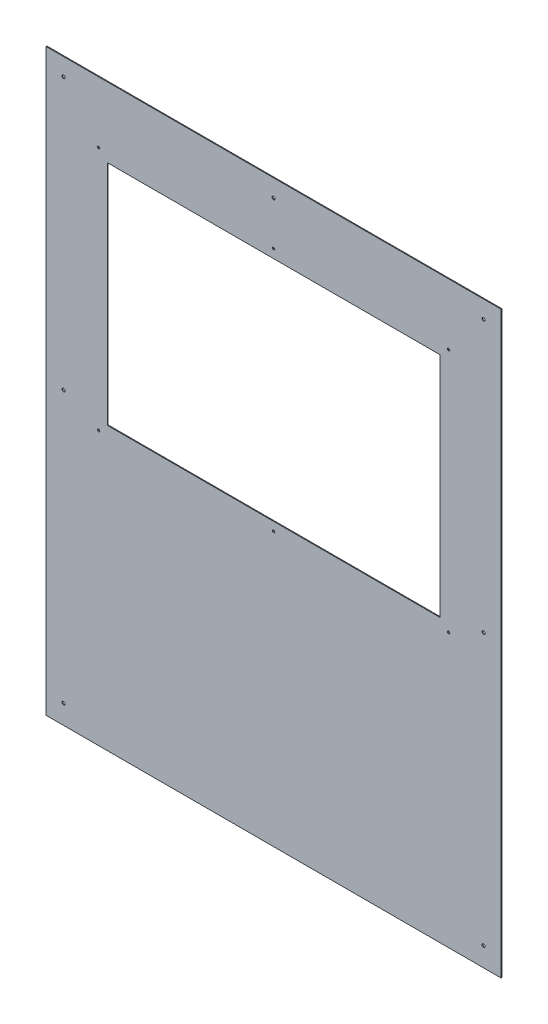
ISO-10303-21;
HEADER;
FILE_DESCRIPTION(('STEP AP214'),'2;1');
FILE_NAME('part.step','',(''),(''),'','','');
FILE_SCHEMA(('AUTOMOTIVE_DESIGN { 1 0 10303 214 1 1 1 1 }'));
ENDSEC;
DATA;
#1=APPLICATION_CONTEXT('core data for automotive mechanical design processes');
#2=APPLICATION_PROTOCOL_DEFINITION('international standard','automotive_design',2000,#1);
#3=PRODUCT_CONTEXT('',#1,'mechanical');
#4=PRODUCT('Part','Part','',(#3));
#5=PRODUCT_RELATED_PRODUCT_CATEGORY('part','',(#4));
#6=PRODUCT_DEFINITION_FORMATION('','',#4);
#7=PRODUCT_DEFINITION_CONTEXT('part definition',#1,'design');
#8=PRODUCT_DEFINITION('design','',#6,#7);
#9=PRODUCT_DEFINITION_SHAPE('','',#8);
#10=(LENGTH_UNIT() NAMED_UNIT(*) SI_UNIT(.MILLI.,.METRE.));
#11=(NAMED_UNIT(*) PLANE_ANGLE_UNIT() SI_UNIT($,.RADIAN.));
#12=(NAMED_UNIT(*) SI_UNIT($,.STERADIAN.) SOLID_ANGLE_UNIT());
#13=UNCERTAINTY_MEASURE_WITH_UNIT(LENGTH_MEASURE(1.E-05),#10,'distance_accuracy_value','');
#14=(GEOMETRIC_REPRESENTATION_CONTEXT(3) GLOBAL_UNCERTAINTY_ASSIGNED_CONTEXT((#13)) GLOBAL_UNIT_ASSIGNED_CONTEXT((#10,
#11,#12)) REPRESENTATION_CONTEXT('',''));
#15=CARTESIAN_POINT('',(0.,0.,0.));
#16=DIRECTION('',(0.,0.,1.));
#17=DIRECTION('',(1.,0.,0.));
#18=AXIS2_PLACEMENT_3D('',#15,#16,#17);
#19=CARTESIAN_POINT('',(0.,0.,1.2192));
#20=DIRECTION('',(1.,0.,0.));
#21=DIRECTION('',(0.,0.,-1.));
#22=AXIS2_PLACEMENT_3D('',#19,#20,#21);
#23=PLANE('',#22);
#24=DIRECTION('',(0.,-1.,0.));
#25=VECTOR('',#24,1.);
#26=CARTESIAN_POINT('',(0.,0.,0.));
#27=LINE('',#26,#25);
#28=CARTESIAN_POINT('',(0.,840.74,0.));
#29=VERTEX_POINT('',#28);
#30=CARTESIAN_POINT('',(0.,0.,0.));
#31=VERTEX_POINT('',#30);
#32=EDGE_CURVE('E170',#29,#31,#27,.T.);
#33=ORIENTED_EDGE('',*,*,#32,.T.);
#34=DIRECTION('',(0.,0.,-1.));
#35=VECTOR('',#34,1.);
#36=CARTESIAN_POINT('',(0.,0.,1.2192));
#37=LINE('',#36,#35);
#38=CARTESIAN_POINT('',(0.,0.,1.2192));
#39=VERTEX_POINT('',#38);
#40=EDGE_CURVE('E197',#39,#31,#37,.T.);
#41=ORIENTED_EDGE('',*,*,#40,.F.);
#42=DIRECTION('',(0.,-1.,0.));
#43=VECTOR('',#42,1.);
#44=CARTESIAN_POINT('',(0.,0.,1.2192));
#45=LINE('',#44,#43);
#46=CARTESIAN_POINT('',(0.,840.74,1.2192));
#47=VERTEX_POINT('',#46);
#48=EDGE_CURVE('E171',#47,#39,#45,.T.);
#49=ORIENTED_EDGE('',*,*,#48,.F.);
#50=DIRECTION('',(0.,0.,-1.));
#51=VECTOR('',#50,1.);
#52=CARTESIAN_POINT('',(0.,840.74,1.2192));
#53=LINE('',#52,#51);
#54=EDGE_CURVE('E181',#47,#29,#53,.T.);
#55=ORIENTED_EDGE('',*,*,#54,.T.);
#56=EDGE_LOOP('',(#33,#41,#49,#55));
#57=FACE_BOUND('',#56,.T.);
#58=ADVANCED_FACE('F35',(#57),#23,.F.);
#59=CARTESIAN_POINT('',(0.,0.,1.2192));
#60=DIRECTION('',(0.,1.,0.));
#61=DIRECTION('',(0.,0.,1.));
#62=AXIS2_PLACEMENT_3D('',#59,#60,#61);
#63=PLANE('',#62);
#64=DIRECTION('',(1.,0.,0.));
#65=VECTOR('',#64,1.);
#66=CARTESIAN_POINT('',(0.,0.,0.));
#67=LINE('',#66,#65);
#68=CARTESIAN_POINT('',(660.4,0.,0.));
#69=VERTEX_POINT('',#68);
#70=EDGE_CURVE('E184',#31,#69,#67,.T.);
#71=ORIENTED_EDGE('',*,*,#70,.T.);
#72=DIRECTION('',(0.,0.,-1.));
#73=VECTOR('',#72,1.);
#74=CARTESIAN_POINT('',(660.4,0.,1.2192));
#75=LINE('',#74,#73);
#76=CARTESIAN_POINT('',(660.4,0.,1.2192));
#77=VERTEX_POINT('',#76);
#78=EDGE_CURVE('E194',#77,#69,#75,.T.);
#79=ORIENTED_EDGE('',*,*,#78,.F.);
#80=DIRECTION('',(1.,0.,0.));
#81=VECTOR('',#80,1.);
#82=CARTESIAN_POINT('',(0.,0.,1.2192));
#83=LINE('',#82,#81);
#84=EDGE_CURVE('E174',#39,#77,#83,.T.);
#85=ORIENTED_EDGE('',*,*,#84,.F.);
#86=ORIENTED_EDGE('',*,*,#40,.T.);
#87=EDGE_LOOP('',(#71,#79,#85,#86));
#88=FACE_BOUND('',#87,.T.);
#89=ADVANCED_FACE('F262',(#88),#63,.F.);
#90=CARTESIAN_POINT('',(660.4,0.,1.2192));
#91=DIRECTION('',(-1.,0.,0.));
#92=DIRECTION('',(0.,0.,1.));
#93=AXIS2_PLACEMENT_3D('',#90,#91,#92);
#94=PLANE('',#93);
#95=DIRECTION('',(0.,1.,0.));
#96=VECTOR('',#95,1.);
#97=CARTESIAN_POINT('',(660.4,0.,0.));
#98=LINE('',#97,#96);
#99=CARTESIAN_POINT('',(660.4,840.74,0.));
#100=VERTEX_POINT('',#99);
#101=EDGE_CURVE('E186',#69,#100,#98,.T.);
#102=ORIENTED_EDGE('',*,*,#101,.T.);
#103=DIRECTION('',(0.,0.,-1.));
#104=VECTOR('',#103,1.);
#105=CARTESIAN_POINT('',(660.4,840.74,1.2192));
#106=LINE('',#105,#104);
#107=CARTESIAN_POINT('',(660.4,840.74,1.2192));
#108=VERTEX_POINT('',#107);
#109=EDGE_CURVE('E191',#108,#100,#106,.T.);
#110=ORIENTED_EDGE('',*,*,#109,.F.);
#111=DIRECTION('',(0.,1.,0.));
#112=VECTOR('',#111,1.);
#113=CARTESIAN_POINT('',(660.4,0.,1.2192));
#114=LINE('',#113,#112);
#115=EDGE_CURVE('E177',#77,#108,#114,.T.);
#116=ORIENTED_EDGE('',*,*,#115,.F.);
#117=ORIENTED_EDGE('',*,*,#78,.T.);
#118=EDGE_LOOP('',(#102,#110,#116,#117));
#119=FACE_BOUND('',#118,.T.);
#120=ADVANCED_FACE('F255',(#119),#94,.F.);
#121=CARTESIAN_POINT('',(0.,840.74,1.2192));
#122=DIRECTION('',(0.,-1.,0.));
#123=DIRECTION('',(0.,0.,-1.));
#124=AXIS2_PLACEMENT_3D('',#121,#122,#123);
#125=PLANE('',#124);
#126=DIRECTION('',(-1.,0.,0.));
#127=VECTOR('',#126,1.);
#128=CARTESIAN_POINT('',(0.,840.74,0.));
#129=LINE('',#128,#127);
#130=EDGE_CURVE('E175',#100,#29,#129,.T.);
#131=ORIENTED_EDGE('',*,*,#130,.T.);
#132=ORIENTED_EDGE('',*,*,#54,.F.);
#133=DIRECTION('',(-1.,0.,0.));
#134=VECTOR('',#133,1.);
#135=CARTESIAN_POINT('',(0.,840.74,1.2192));
#136=LINE('',#135,#134);
#137=EDGE_CURVE('E179',#108,#47,#136,.T.);
#138=ORIENTED_EDGE('',*,*,#137,.F.);
#139=ORIENTED_EDGE('',*,*,#109,.T.);
#140=EDGE_LOOP('',(#131,#132,#138,#139));
#141=FACE_BOUND('',#140,.T.);
#142=ADVANCED_FACE('F245',(#141),#125,.F.);
#143=CARTESIAN_POINT('',(0.,0.,1.2192));
#144=DIRECTION('',(0.,0.,-1.));
#145=DIRECTION('',(-1.,0.,0.));
#146=AXIS2_PLACEMENT_3D('',#143,#144,#145);
#147=PLANE('',#146);
#148=CARTESIAN_POINT('',(76.2,751.84,1.2192));
#149=DIRECTION('',(0.,0.,1.));
#150=DIRECTION('',(1.,0.,0.));
#151=AXIS2_PLACEMENT_3D('',#148,#149,#150);
#152=CIRCLE('',#151,1.72719999999998);
#153=CARTESIAN_POINT('',(77.9272,751.84,1.2192));
#154=VERTEX_POINT('',#153);
#155=EDGE_CURVE('E228',#154,#154,#152,.T.);
#156=ORIENTED_EDGE('',*,*,#155,.F.);
#157=EDGE_LOOP('',(#156));
#158=FACE_BOUND('',#157,.T.);
#159=CARTESIAN_POINT('',(330.2,751.84,1.2192));
#160=DIRECTION('',(0.,0.,1.));
#161=DIRECTION('',(1.,0.,0.));
#162=AXIS2_PLACEMENT_3D('',#159,#160,#161);
#163=CIRCLE('',#162,1.72719999999998);
#164=CARTESIAN_POINT('',(331.9272,751.84,1.2192));
#165=VERTEX_POINT('',#164);
#166=EDGE_CURVE('E218',#165,#165,#163,.T.);
#167=ORIENTED_EDGE('',*,*,#166,.F.);
#168=EDGE_LOOP('',(#167));
#169=FACE_BOUND('',#168,.T.);
#170=CARTESIAN_POINT('',(584.2,751.84,1.2192));
#171=DIRECTION('',(0.,0.,1.));
#172=DIRECTION('',(1.,0.,0.));
#173=AXIS2_PLACEMENT_3D('',#170,#171,#172);
#174=CIRCLE('',#173,1.72720000000004);
#175=CARTESIAN_POINT('',(585.9272,751.84,1.2192));
#176=VERTEX_POINT('',#175);
#177=EDGE_CURVE('E215',#176,#176,#174,.T.);
#178=ORIENTED_EDGE('',*,*,#177,.F.);
#179=EDGE_LOOP('',(#178));
#180=FACE_BOUND('',#179,.T.);
#181=CARTESIAN_POINT('',(584.2,396.24,1.2192));
#182=DIRECTION('',(0.,0.,1.));
#183=DIRECTION('',(1.,0.,0.));
#184=AXIS2_PLACEMENT_3D('',#181,#182,#183);
#185=CIRCLE('',#184,1.72720000000004);
#186=CARTESIAN_POINT('',(585.9272,396.24,1.2192));
#187=VERTEX_POINT('',#186);
#188=EDGE_CURVE('E214',#187,#187,#185,.T.);
#189=ORIENTED_EDGE('',*,*,#188,.F.);
#190=EDGE_LOOP('',(#189));
#191=FACE_BOUND('',#190,.T.);
#192=CARTESIAN_POINT('',(330.2,396.24,1.2192));
#193=DIRECTION('',(0.,0.,1.));
#194=DIRECTION('',(1.,0.,0.));
#195=AXIS2_PLACEMENT_3D('',#192,#193,#194);
#196=CIRCLE('',#195,1.72719999999998);
#197=CARTESIAN_POINT('',(331.9272,396.24,1.2192));
#198=VERTEX_POINT('',#197);
#199=EDGE_CURVE('E211',#198,#198,#196,.T.);
#200=ORIENTED_EDGE('',*,*,#199,.F.);
#201=EDGE_LOOP('',(#200));
#202=FACE_BOUND('',#201,.T.);
#203=CARTESIAN_POINT('',(76.2,396.24,1.2192));
#204=DIRECTION('',(0.,0.,1.));
#205=DIRECTION('',(1.,0.,0.));
#206=AXIS2_PLACEMENT_3D('',#203,#204,#205);
#207=CIRCLE('',#206,1.72719999999998);
#208=CARTESIAN_POINT('',(77.9272,396.24,1.2192));
#209=VERTEX_POINT('',#208);
#210=EDGE_CURVE('E207',#209,#209,#207,.T.);
#211=ORIENTED_EDGE('',*,*,#210,.F.);
#212=EDGE_LOOP('',(#211));
#213=FACE_BOUND('',#212,.T.);
#214=DIRECTION('',(1.,0.,0.));
#215=VECTOR('',#214,1.);
#216=CARTESIAN_POINT('',(88.9,408.94,1.2192));
#217=LINE('',#216,#215);
#218=CARTESIAN_POINT('',(88.9,408.94,1.2192));
#219=VERTEX_POINT('',#218);
#220=CARTESIAN_POINT('',(571.5,408.94,1.2192));
#221=VERTEX_POINT('',#220);
#222=EDGE_CURVE('E112',#219,#221,#217,.T.);
#223=ORIENTED_EDGE('',*,*,#222,.F.);
#224=DIRECTION('',(0.,-1.,0.));
#225=VECTOR('',#224,1.);
#226=CARTESIAN_POINT('',(88.9,739.14,1.2192));
#227=LINE('',#226,#225);
#228=CARTESIAN_POINT('',(88.9,739.14,1.2192));
#229=VERTEX_POINT('',#228);
#230=EDGE_CURVE('E51',#229,#219,#227,.T.);
#231=ORIENTED_EDGE('',*,*,#230,.F.);
#232=DIRECTION('',(-1.,0.,0.));
#233=VECTOR('',#232,1.);
#234=CARTESIAN_POINT('',(88.9,739.14,1.2192));
#235=LINE('',#234,#233);
#236=CARTESIAN_POINT('',(571.5,739.14,1.2192));
#237=VERTEX_POINT('',#236);
#238=EDGE_CURVE('E119',#237,#229,#235,.T.);
#239=ORIENTED_EDGE('',*,*,#238,.F.);
#240=DIRECTION('',(0.,1.,0.));
#241=VECTOR('',#240,1.);
#242=CARTESIAN_POINT('',(571.5,739.14,1.2192));
#243=LINE('',#242,#241);
#244=EDGE_CURVE('E103',#221,#237,#243,.T.);
#245=ORIENTED_EDGE('',*,*,#244,.F.);
#246=EDGE_LOOP('',(#223,#231,#239,#245));
#247=FACE_BOUND('',#246,.T.);
#248=CARTESIAN_POINT('',(25.4,815.34,1.2192));
#249=DIRECTION('',(0.,0.,1.));
#250=DIRECTION('',(1.,0.,0.));
#251=AXIS2_PLACEMENT_3D('',#248,#249,#250);
#252=CIRCLE('',#251,2.2479);
#253=CARTESIAN_POINT('',(27.6479,815.34,1.2192));
#254=VERTEX_POINT('',#253);
#255=EDGE_CURVE('E126',#254,#254,#252,.T.);
#256=ORIENTED_EDGE('',*,*,#255,.F.);
#257=EDGE_LOOP('',(#256));
#258=FACE_BOUND('',#257,.T.);
#259=CARTESIAN_POINT('',(330.2,815.34,1.2192));
#260=DIRECTION('',(0.,0.,1.));
#261=DIRECTION('',(1.,0.,0.));
#262=AXIS2_PLACEMENT_3D('',#259,#260,#261);
#263=CIRCLE('',#262,2.24790000000002);
#264=CARTESIAN_POINT('',(332.4479,815.34,1.2192));
#265=VERTEX_POINT('',#264);
#266=EDGE_CURVE('E134',#265,#265,#263,.T.);
#267=ORIENTED_EDGE('',*,*,#266,.F.);
#268=EDGE_LOOP('',(#267));
#269=FACE_BOUND('',#268,.T.);
#270=CARTESIAN_POINT('',(635.,815.34,1.2192));
#271=DIRECTION('',(0.,0.,1.));
#272=DIRECTION('',(1.,0.,0.));
#273=AXIS2_PLACEMENT_3D('',#270,#271,#272);
#274=CIRCLE('',#273,2.24789999999997);
#275=CARTESIAN_POINT('',(637.2479,815.34,1.2192));
#276=VERTEX_POINT('',#275);
#277=EDGE_CURVE('E140',#276,#276,#274,.T.);
#278=ORIENTED_EDGE('',*,*,#277,.F.);
#279=EDGE_LOOP('',(#278));
#280=FACE_BOUND('',#279,.T.);
#281=CARTESIAN_POINT('',(25.4000000000001,421.64,1.2192));
#282=DIRECTION('',(0.,0.,1.));
#283=DIRECTION('',(1.,0.,0.));
#284=AXIS2_PLACEMENT_3D('',#281,#282,#283);
#285=CIRCLE('',#284,2.2479);
#286=CARTESIAN_POINT('',(27.6479000000001,421.64,1.2192));
#287=VERTEX_POINT('',#286);
#288=EDGE_CURVE('E146',#287,#287,#285,.T.);
#289=ORIENTED_EDGE('',*,*,#288,.F.);
#290=EDGE_LOOP('',(#289));
#291=FACE_BOUND('',#290,.T.);
#292=CARTESIAN_POINT('',(25.4000000000001,27.9400000000001,1.2192));
#293=DIRECTION('',(0.,0.,1.));
#294=DIRECTION('',(1.,0.,0.));
#295=AXIS2_PLACEMENT_3D('',#292,#293,#294);
#296=CIRCLE('',#295,2.2479);
#297=CARTESIAN_POINT('',(27.6479000000001,27.9400000000001,1.2192));
#298=VERTEX_POINT('',#297);
#299=EDGE_CURVE('E152',#298,#298,#296,.T.);
#300=ORIENTED_EDGE('',*,*,#299,.F.);
#301=EDGE_LOOP('',(#300));
#302=FACE_BOUND('',#301,.T.);
#303=CARTESIAN_POINT('',(635.,27.9400000000001,1.2192));
#304=DIRECTION('',(0.,0.,1.));
#305=DIRECTION('',(1.,0.,0.));
#306=AXIS2_PLACEMENT_3D('',#303,#304,#305);
#307=CIRCLE('',#306,2.24789999999997);
#308=CARTESIAN_POINT('',(637.2479,27.9400000000001,1.2192));
#309=VERTEX_POINT('',#308);
#310=EDGE_CURVE('E158',#309,#309,#307,.T.);
#311=ORIENTED_EDGE('',*,*,#310,.F.);
#312=EDGE_LOOP('',(#311));
#313=FACE_BOUND('',#312,.T.);
#314=CARTESIAN_POINT('',(635.,421.64,1.2192));
#315=DIRECTION('',(0.,0.,1.));
#316=DIRECTION('',(1.,0.,0.));
#317=AXIS2_PLACEMENT_3D('',#314,#315,#316);
#318=CIRCLE('',#317,2.24789999999997);
#319=CARTESIAN_POINT('',(637.2479,421.64,1.2192));
#320=VERTEX_POINT('',#319);
#321=EDGE_CURVE('E164',#320,#320,#318,.T.);
#322=ORIENTED_EDGE('',*,*,#321,.F.);
#323=EDGE_LOOP('',(#322));
#324=FACE_BOUND('',#323,.T.);
#325=ORIENTED_EDGE('',*,*,#48,.T.);
#326=ORIENTED_EDGE('',*,*,#84,.T.);
#327=ORIENTED_EDGE('',*,*,#115,.T.);
#328=ORIENTED_EDGE('',*,*,#137,.T.);
#329=EDGE_LOOP('',(#325,#326,#327,#328));
#330=FACE_BOUND('',#329,.T.);
#331=ADVANCED_FACE('F116',(#158,#169,#180,#191,#202,#213,#247,#258,#269,#280,#291,#302,#313,
#324,#330),#147,.F.);
#332=CARTESIAN_POINT('',(0.,0.,0.));
#333=DIRECTION('',(0.,0.,-1.));
#334=DIRECTION('',(-1.,0.,0.));
#335=AXIS2_PLACEMENT_3D('',#332,#333,#334);
#336=PLANE('',#335);
#337=CARTESIAN_POINT('',(76.2,751.84,0.));
#338=DIRECTION('',(0.,0.,-1.));
#339=DIRECTION('',(-1.,0.,0.));
#340=AXIS2_PLACEMENT_3D('',#337,#338,#339);
#341=CIRCLE('',#340,1.72719999999998);
#342=CARTESIAN_POINT('',(74.4728,751.84,0.));
#343=VERTEX_POINT('',#342);
#344=EDGE_CURVE('E38',#343,#343,#341,.T.);
#345=ORIENTED_EDGE('',*,*,#344,.F.);
#346=EDGE_LOOP('',(#345));
#347=FACE_BOUND('',#346,.T.);
#348=CARTESIAN_POINT('',(330.2,751.84,0.));
#349=DIRECTION('',(0.,0.,-1.));
#350=DIRECTION('',(-1.,0.,0.));
#351=AXIS2_PLACEMENT_3D('',#348,#349,#350);
#352=CIRCLE('',#351,1.72719999999998);
#353=CARTESIAN_POINT('',(328.4728,751.84,0.));
#354=VERTEX_POINT('',#353);
#355=EDGE_CURVE('E216',#354,#354,#352,.T.);
#356=ORIENTED_EDGE('',*,*,#355,.F.);
#357=EDGE_LOOP('',(#356));
#358=FACE_BOUND('',#357,.T.);
#359=CARTESIAN_POINT('',(584.2,751.84,0.));
#360=DIRECTION('',(0.,0.,-1.));
#361=DIRECTION('',(-1.,0.,0.));
#362=AXIS2_PLACEMENT_3D('',#359,#360,#361);
#363=CIRCLE('',#362,1.72720000000004);
#364=CARTESIAN_POINT('',(582.4728,751.84,0.));
#365=VERTEX_POINT('',#364);
#366=EDGE_CURVE('E212',#365,#365,#363,.T.);
#367=ORIENTED_EDGE('',*,*,#366,.F.);
#368=EDGE_LOOP('',(#367));
#369=FACE_BOUND('',#368,.T.);
#370=CARTESIAN_POINT('',(584.2,396.24,0.));
#371=DIRECTION('',(0.,0.,-1.));
#372=DIRECTION('',(-1.,0.,0.));
#373=AXIS2_PLACEMENT_3D('',#370,#371,#372);
#374=CIRCLE('',#373,1.72720000000004);
#375=CARTESIAN_POINT('',(582.4728,396.24,0.));
#376=VERTEX_POINT('',#375);
#377=EDGE_CURVE('E233',#376,#376,#374,.T.);
#378=ORIENTED_EDGE('',*,*,#377,.F.);
#379=EDGE_LOOP('',(#378));
#380=FACE_BOUND('',#379,.T.);
#381=CARTESIAN_POINT('',(330.2,396.24,0.));
#382=DIRECTION('',(0.,0.,-1.));
#383=DIRECTION('',(-1.,0.,0.));
#384=AXIS2_PLACEMENT_3D('',#381,#382,#383);
#385=CIRCLE('',#384,1.72719999999998);
#386=CARTESIAN_POINT('',(328.4728,396.24,0.));
#387=VERTEX_POINT('',#386);
#388=EDGE_CURVE('E208',#387,#387,#385,.T.);
#389=ORIENTED_EDGE('',*,*,#388,.F.);
#390=EDGE_LOOP('',(#389));
#391=FACE_BOUND('',#390,.T.);
#392=CARTESIAN_POINT('',(76.2,396.24,0.));
#393=DIRECTION('',(0.,0.,-1.));
#394=DIRECTION('',(-1.,0.,0.));
#395=AXIS2_PLACEMENT_3D('',#392,#393,#394);
#396=CIRCLE('',#395,1.72719999999998);
#397=CARTESIAN_POINT('',(74.4728,396.24,0.));
#398=VERTEX_POINT('',#397);
#399=EDGE_CURVE('E204',#398,#398,#396,.T.);
#400=ORIENTED_EDGE('',*,*,#399,.F.);
#401=EDGE_LOOP('',(#400));
#402=FACE_BOUND('',#401,.T.);
#403=DIRECTION('',(0.,1.,0.));
#404=VECTOR('',#403,1.);
#405=CARTESIAN_POINT('',(88.9000000000001,0.,0.));
#406=LINE('',#405,#404);
#407=CARTESIAN_POINT('',(88.9,408.94,0.));
#408=VERTEX_POINT('',#407);
#409=CARTESIAN_POINT('',(88.9,739.14,0.));
#410=VERTEX_POINT('',#409);
#411=EDGE_CURVE('E11',#408,#410,#406,.T.);
#412=ORIENTED_EDGE('',*,*,#411,.F.);
#413=DIRECTION('',(-1.,0.,0.));
#414=VECTOR('',#413,1.);
#415=CARTESIAN_POINT('',(0.,408.94,0.));
#416=LINE('',#415,#414);
#417=CARTESIAN_POINT('',(571.5,408.94,0.));
#418=VERTEX_POINT('',#417);
#419=EDGE_CURVE('E200',#418,#408,#416,.T.);
#420=ORIENTED_EDGE('',*,*,#419,.F.);
#421=DIRECTION('',(0.,-1.,0.));
#422=VECTOR('',#421,1.);
#423=CARTESIAN_POINT('',(571.5,1.92153985031277E-13,0.));
#424=LINE('',#423,#422);
#425=CARTESIAN_POINT('',(571.5,739.14,0.));
#426=VERTEX_POINT('',#425);
#427=EDGE_CURVE('E106',#426,#418,#424,.T.);
#428=ORIENTED_EDGE('',*,*,#427,.F.);
#429=DIRECTION('',(1.,0.,0.));
#430=VECTOR('',#429,1.);
#431=CARTESIAN_POINT('',(0.,739.14,0.));
#432=LINE('',#431,#430);
#433=EDGE_CURVE('E43',#410,#426,#432,.T.);
#434=ORIENTED_EDGE('',*,*,#433,.F.);
#435=EDGE_LOOP('',(#412,#420,#428,#434));
#436=FACE_BOUND('',#435,.T.);
#437=CARTESIAN_POINT('',(25.4,815.34,0.));
#438=DIRECTION('',(0.,0.,1.));
#439=DIRECTION('',(1.,0.,0.));
#440=AXIS2_PLACEMENT_3D('',#437,#438,#439);
#441=CIRCLE('',#440,2.2479);
#442=CARTESIAN_POINT('',(27.6479,815.34,0.));
#443=VERTEX_POINT('',#442);
#444=EDGE_CURVE('E131',#443,#443,#441,.T.);
#445=ORIENTED_EDGE('',*,*,#444,.T.);
#446=EDGE_LOOP('',(#445));
#447=FACE_BOUND('',#446,.T.);
#448=CARTESIAN_POINT('',(330.2,815.34,0.));
#449=DIRECTION('',(0.,0.,1.));
#450=DIRECTION('',(1.,0.,0.));
#451=AXIS2_PLACEMENT_3D('',#448,#449,#450);
#452=CIRCLE('',#451,2.24790000000002);
#453=CARTESIAN_POINT('',(332.4479,815.34,0.));
#454=VERTEX_POINT('',#453);
#455=EDGE_CURVE('E137',#454,#454,#452,.T.);
#456=ORIENTED_EDGE('',*,*,#455,.T.);
#457=EDGE_LOOP('',(#456));
#458=FACE_BOUND('',#457,.T.);
#459=CARTESIAN_POINT('',(635.,815.34,0.));
#460=DIRECTION('',(0.,0.,1.));
#461=DIRECTION('',(1.,0.,0.));
#462=AXIS2_PLACEMENT_3D('',#459,#460,#461);
#463=CIRCLE('',#462,2.24789999999997);
#464=CARTESIAN_POINT('',(637.2479,815.34,0.));
#465=VERTEX_POINT('',#464);
#466=EDGE_CURVE('E143',#465,#465,#463,.T.);
#467=ORIENTED_EDGE('',*,*,#466,.T.);
#468=EDGE_LOOP('',(#467));
#469=FACE_BOUND('',#468,.T.);
#470=CARTESIAN_POINT('',(25.4000000000001,421.64,0.));
#471=DIRECTION('',(0.,0.,1.));
#472=DIRECTION('',(1.,0.,0.));
#473=AXIS2_PLACEMENT_3D('',#470,#471,#472);
#474=CIRCLE('',#473,2.2479);
#475=CARTESIAN_POINT('',(27.6479000000001,421.64,0.));
#476=VERTEX_POINT('',#475);
#477=EDGE_CURVE('E149',#476,#476,#474,.T.);
#478=ORIENTED_EDGE('',*,*,#477,.T.);
#479=EDGE_LOOP('',(#478));
#480=FACE_BOUND('',#479,.T.);
#481=CARTESIAN_POINT('',(25.4000000000001,27.9400000000001,0.));
#482=DIRECTION('',(0.,0.,1.));
#483=DIRECTION('',(1.,0.,0.));
#484=AXIS2_PLACEMENT_3D('',#481,#482,#483);
#485=CIRCLE('',#484,2.2479);
#486=CARTESIAN_POINT('',(27.6479000000001,27.9400000000001,0.));
#487=VERTEX_POINT('',#486);
#488=EDGE_CURVE('E155',#487,#487,#485,.T.);
#489=ORIENTED_EDGE('',*,*,#488,.T.);
#490=EDGE_LOOP('',(#489));
#491=FACE_BOUND('',#490,.T.);
#492=CARTESIAN_POINT('',(635.,27.9400000000001,0.));
#493=DIRECTION('',(0.,0.,1.));
#494=DIRECTION('',(1.,0.,0.));
#495=AXIS2_PLACEMENT_3D('',#492,#493,#494);
#496=CIRCLE('',#495,2.24789999999997);
#497=CARTESIAN_POINT('',(637.2479,27.9400000000001,0.));
#498=VERTEX_POINT('',#497);
#499=EDGE_CURVE('E161',#498,#498,#496,.T.);
#500=ORIENTED_EDGE('',*,*,#499,.T.);
#501=EDGE_LOOP('',(#500));
#502=FACE_BOUND('',#501,.T.);
#503=CARTESIAN_POINT('',(635.,421.64,0.));
#504=DIRECTION('',(0.,0.,1.));
#505=DIRECTION('',(1.,0.,0.));
#506=AXIS2_PLACEMENT_3D('',#503,#504,#505);
#507=CIRCLE('',#506,2.24789999999997);
#508=CARTESIAN_POINT('',(637.2479,421.64,0.));
#509=VERTEX_POINT('',#508);
#510=EDGE_CURVE('E167',#509,#509,#507,.T.);
#511=ORIENTED_EDGE('',*,*,#510,.T.);
#512=EDGE_LOOP('',(#511));
#513=FACE_BOUND('',#512,.T.);
#514=ORIENTED_EDGE('',*,*,#32,.F.);
#515=ORIENTED_EDGE('',*,*,#130,.F.);
#516=ORIENTED_EDGE('',*,*,#101,.F.);
#517=ORIENTED_EDGE('',*,*,#70,.F.);
#518=EDGE_LOOP('',(#514,#515,#516,#517));
#519=FACE_BOUND('',#518,.T.);
#520=ADVANCED_FACE('F244',(#347,#358,#369,#380,#391,#402,#436,#447,#458,#469,#480,#491,#502,
#513,#519),#336,.T.);
#521=CARTESIAN_POINT('',(635.,421.64,1.2192));
#522=DIRECTION('',(0.,0.,1.));
#523=DIRECTION('',(1.,0.,0.));
#524=AXIS2_PLACEMENT_3D('',#521,#522,#523);
#525=CYLINDRICAL_SURFACE('',#524,2.24789999999997);
#526=ORIENTED_EDGE('',*,*,#510,.F.);
#527=EDGE_LOOP('',(#526));
#528=FACE_BOUND('',#527,.T.);
#529=ORIENTED_EDGE('',*,*,#321,.T.);
#530=EDGE_LOOP('',(#529));
#531=FACE_BOUND('',#530,.T.);
#532=ADVANCED_FACE('F252',(#528,#531),#525,.F.);
#533=CARTESIAN_POINT('',(635.,27.9400000000001,1.2192));
#534=DIRECTION('',(0.,0.,1.));
#535=DIRECTION('',(1.,0.,0.));
#536=AXIS2_PLACEMENT_3D('',#533,#534,#535);
#537=CYLINDRICAL_SURFACE('',#536,2.24789999999997);
#538=ORIENTED_EDGE('',*,*,#499,.F.);
#539=EDGE_LOOP('',(#538));
#540=FACE_BOUND('',#539,.T.);
#541=ORIENTED_EDGE('',*,*,#310,.T.);
#542=EDGE_LOOP('',(#541));
#543=FACE_BOUND('',#542,.T.);
#544=ADVANCED_FACE('F301',(#540,#543),#537,.F.);
#545=CARTESIAN_POINT('',(25.4000000000001,27.9400000000001,1.2192));
#546=DIRECTION('',(0.,0.,1.));
#547=DIRECTION('',(1.,0.,0.));
#548=AXIS2_PLACEMENT_3D('',#545,#546,#547);
#549=CYLINDRICAL_SURFACE('',#548,2.2479);
#550=ORIENTED_EDGE('',*,*,#488,.F.);
#551=EDGE_LOOP('',(#550));
#552=FACE_BOUND('',#551,.T.);
#553=ORIENTED_EDGE('',*,*,#299,.T.);
#554=EDGE_LOOP('',(#553));
#555=FACE_BOUND('',#554,.T.);
#556=ADVANCED_FACE('F311',(#552,#555),#549,.F.);
#557=CARTESIAN_POINT('',(25.4000000000001,421.64,1.2192));
#558=DIRECTION('',(0.,0.,1.));
#559=DIRECTION('',(1.,0.,0.));
#560=AXIS2_PLACEMENT_3D('',#557,#558,#559);
#561=CYLINDRICAL_SURFACE('',#560,2.2479);
#562=ORIENTED_EDGE('',*,*,#477,.F.);
#563=EDGE_LOOP('',(#562));
#564=FACE_BOUND('',#563,.T.);
#565=ORIENTED_EDGE('',*,*,#288,.T.);
#566=EDGE_LOOP('',(#565));
#567=FACE_BOUND('',#566,.T.);
#568=ADVANCED_FACE('F321',(#564,#567),#561,.F.);
#569=CARTESIAN_POINT('',(635.,815.34,1.2192));
#570=DIRECTION('',(0.,0.,1.));
#571=DIRECTION('',(1.,0.,0.));
#572=AXIS2_PLACEMENT_3D('',#569,#570,#571);
#573=CYLINDRICAL_SURFACE('',#572,2.24789999999997);
#574=ORIENTED_EDGE('',*,*,#466,.F.);
#575=EDGE_LOOP('',(#574));
#576=FACE_BOUND('',#575,.T.);
#577=ORIENTED_EDGE('',*,*,#277,.T.);
#578=EDGE_LOOP('',(#577));
#579=FACE_BOUND('',#578,.T.);
#580=ADVANCED_FACE('F331',(#576,#579),#573,.F.);
#581=CARTESIAN_POINT('',(330.2,815.34,1.2192));
#582=DIRECTION('',(0.,0.,1.));
#583=DIRECTION('',(1.,0.,0.));
#584=AXIS2_PLACEMENT_3D('',#581,#582,#583);
#585=CYLINDRICAL_SURFACE('',#584,2.24790000000002);
#586=ORIENTED_EDGE('',*,*,#455,.F.);
#587=EDGE_LOOP('',(#586));
#588=FACE_BOUND('',#587,.T.);
#589=ORIENTED_EDGE('',*,*,#266,.T.);
#590=EDGE_LOOP('',(#589));
#591=FACE_BOUND('',#590,.T.);
#592=ADVANCED_FACE('F341',(#588,#591),#585,.F.);
#593=CARTESIAN_POINT('',(25.4,815.34,1.2192));
#594=DIRECTION('',(0.,0.,1.));
#595=DIRECTION('',(1.,0.,0.));
#596=AXIS2_PLACEMENT_3D('',#593,#594,#595);
#597=CYLINDRICAL_SURFACE('',#596,2.2479);
#598=ORIENTED_EDGE('',*,*,#444,.F.);
#599=EDGE_LOOP('',(#598));
#600=FACE_BOUND('',#599,.T.);
#601=ORIENTED_EDGE('',*,*,#255,.T.);
#602=EDGE_LOOP('',(#601));
#603=FACE_BOUND('',#602,.T.);
#604=ADVANCED_FACE('F351',(#600,#603),#597,.F.);
#605=CARTESIAN_POINT('',(88.9,739.14,-1.3208));
#606=DIRECTION('',(-1.,0.,0.));
#607=DIRECTION('',(0.,-1.,0.));
#608=AXIS2_PLACEMENT_3D('',#605,#606,#607);
#609=PLANE('',#608);
#610=ORIENTED_EDGE('',*,*,#411,.T.);
#611=DIRECTION('',(0.,0.,1.));
#612=VECTOR('',#611,1.);
#613=CARTESIAN_POINT('',(88.9,739.14,-1.3208));
#614=LINE('',#613,#612);
#615=EDGE_CURVE('E124',#410,#229,#614,.T.);
#616=ORIENTED_EDGE('',*,*,#615,.T.);
#617=ORIENTED_EDGE('',*,*,#230,.T.);
#618=DIRECTION('',(0.,0.,1.));
#619=VECTOR('',#618,1.);
#620=CARTESIAN_POINT('',(88.9,408.94,-1.3208));
#621=LINE('',#620,#619);
#622=EDGE_CURVE('E109',#408,#219,#621,.T.);
#623=ORIENTED_EDGE('',*,*,#622,.F.);
#624=EDGE_LOOP('',(#610,#616,#617,#623));
#625=FACE_BOUND('',#624,.T.);
#626=ADVANCED_FACE('F361',(#625),#609,.F.);
#627=CARTESIAN_POINT('',(88.9,739.14,-1.3208));
#628=DIRECTION('',(0.,1.,0.));
#629=DIRECTION('',(0.,0.,1.));
#630=AXIS2_PLACEMENT_3D('',#627,#628,#629);
#631=PLANE('',#630);
#632=ORIENTED_EDGE('',*,*,#433,.T.);
#633=DIRECTION('',(0.,0.,1.));
#634=VECTOR('',#633,1.);
#635=CARTESIAN_POINT('',(571.5,739.14,-1.3208));
#636=LINE('',#635,#634);
#637=EDGE_CURVE('E108',#426,#237,#636,.T.);
#638=ORIENTED_EDGE('',*,*,#637,.T.);
#639=ORIENTED_EDGE('',*,*,#238,.T.);
#640=ORIENTED_EDGE('',*,*,#615,.F.);
#641=EDGE_LOOP('',(#632,#638,#639,#640));
#642=FACE_BOUND('',#641,.T.);
#643=ADVANCED_FACE('F371',(#642),#631,.F.);
#644=CARTESIAN_POINT('',(571.5,739.14,-1.3208));
#645=DIRECTION('',(1.,0.,0.));
#646=DIRECTION('',(0.,1.,0.));
#647=AXIS2_PLACEMENT_3D('',#644,#645,#646);
#648=PLANE('',#647);
#649=ORIENTED_EDGE('',*,*,#427,.T.);
#650=DIRECTION('',(0.,0.,1.));
#651=VECTOR('',#650,1.);
#652=CARTESIAN_POINT('',(571.5,408.94,-1.3208));
#653=LINE('',#652,#651);
#654=EDGE_CURVE('E59',#418,#221,#653,.T.);
#655=ORIENTED_EDGE('',*,*,#654,.T.);
#656=ORIENTED_EDGE('',*,*,#244,.T.);
#657=ORIENTED_EDGE('',*,*,#637,.F.);
#658=EDGE_LOOP('',(#649,#655,#656,#657));
#659=FACE_BOUND('',#658,.T.);
#660=ADVANCED_FACE('F100',(#659),#648,.F.);
#661=CARTESIAN_POINT('',(88.9,408.94,-1.3208));
#662=DIRECTION('',(0.,-1.,0.));
#663=DIRECTION('',(0.,0.,-1.));
#664=AXIS2_PLACEMENT_3D('',#661,#662,#663);
#665=PLANE('',#664);
#666=ORIENTED_EDGE('',*,*,#419,.T.);
#667=ORIENTED_EDGE('',*,*,#622,.T.);
#668=ORIENTED_EDGE('',*,*,#222,.T.);
#669=ORIENTED_EDGE('',*,*,#654,.F.);
#670=EDGE_LOOP('',(#666,#667,#668,#669));
#671=FACE_BOUND('',#670,.T.);
#672=ADVANCED_FACE('F113',(#671),#665,.F.);
#673=CARTESIAN_POINT('',(76.2,396.24,1.2192));
#674=DIRECTION('',(0.,0.,1.));
#675=DIRECTION('',(1.,0.,0.));
#676=AXIS2_PLACEMENT_3D('',#673,#674,#675);
#677=CYLINDRICAL_SURFACE('',#676,1.72719999999998);
#678=ORIENTED_EDGE('',*,*,#399,.T.);
#679=EDGE_LOOP('',(#678));
#680=FACE_BOUND('',#679,.T.);
#681=ORIENTED_EDGE('',*,*,#210,.T.);
#682=EDGE_LOOP('',(#681));
#683=FACE_BOUND('',#682,.T.);
#684=ADVANCED_FACE('F241',(#680,#683),#677,.F.);
#685=CARTESIAN_POINT('',(330.2,396.24,1.2192));
#686=DIRECTION('',(0.,0.,1.));
#687=DIRECTION('',(1.,0.,0.));
#688=AXIS2_PLACEMENT_3D('',#685,#686,#687);
#689=CYLINDRICAL_SURFACE('',#688,1.72719999999998);
#690=ORIENTED_EDGE('',*,*,#388,.T.);
#691=EDGE_LOOP('',(#690));
#692=FACE_BOUND('',#691,.T.);
#693=ORIENTED_EDGE('',*,*,#199,.T.);
#694=EDGE_LOOP('',(#693));
#695=FACE_BOUND('',#694,.T.);
#696=ADVANCED_FACE('F413',(#692,#695),#689,.F.);
#697=CARTESIAN_POINT('',(584.2,396.24,1.2192));
#698=DIRECTION('',(0.,0.,1.));
#699=DIRECTION('',(1.,0.,0.));
#700=AXIS2_PLACEMENT_3D('',#697,#698,#699);
#701=CYLINDRICAL_SURFACE('',#700,1.72720000000004);
#702=ORIENTED_EDGE('',*,*,#377,.T.);
#703=EDGE_LOOP('',(#702));
#704=FACE_BOUND('',#703,.T.);
#705=ORIENTED_EDGE('',*,*,#188,.T.);
#706=EDGE_LOOP('',(#705));
#707=FACE_BOUND('',#706,.T.);
#708=ADVANCED_FACE('F423',(#704,#707),#701,.F.);
#709=CARTESIAN_POINT('',(584.2,751.84,1.2192));
#710=DIRECTION('',(0.,0.,1.));
#711=DIRECTION('',(1.,0.,0.));
#712=AXIS2_PLACEMENT_3D('',#709,#710,#711);
#713=CYLINDRICAL_SURFACE('',#712,1.72720000000004);
#714=ORIENTED_EDGE('',*,*,#366,.T.);
#715=EDGE_LOOP('',(#714));
#716=FACE_BOUND('',#715,.T.);
#717=ORIENTED_EDGE('',*,*,#177,.T.);
#718=EDGE_LOOP('',(#717));
#719=FACE_BOUND('',#718,.T.);
#720=ADVANCED_FACE('F433',(#716,#719),#713,.F.);
#721=CARTESIAN_POINT('',(330.2,751.84,1.2192));
#722=DIRECTION('',(0.,0.,1.));
#723=DIRECTION('',(1.,0.,0.));
#724=AXIS2_PLACEMENT_3D('',#721,#722,#723);
#725=CYLINDRICAL_SURFACE('',#724,1.72719999999998);
#726=ORIENTED_EDGE('',*,*,#355,.T.);
#727=EDGE_LOOP('',(#726));
#728=FACE_BOUND('',#727,.T.);
#729=ORIENTED_EDGE('',*,*,#166,.T.);
#730=EDGE_LOOP('',(#729));
#731=FACE_BOUND('',#730,.T.);
#732=ADVANCED_FACE('F443',(#728,#731),#725,.F.);
#733=CARTESIAN_POINT('',(76.2,751.84,1.2192));
#734=DIRECTION('',(0.,0.,1.));
#735=DIRECTION('',(1.,0.,0.));
#736=AXIS2_PLACEMENT_3D('',#733,#734,#735);
#737=CYLINDRICAL_SURFACE('',#736,1.72719999999998);
#738=ORIENTED_EDGE('',*,*,#344,.T.);
#739=EDGE_LOOP('',(#738));
#740=FACE_BOUND('',#739,.T.);
#741=ORIENTED_EDGE('',*,*,#155,.T.);
#742=EDGE_LOOP('',(#741));
#743=FACE_BOUND('',#742,.T.);
#744=ADVANCED_FACE('F453',(#740,#743),#737,.F.);
#745=CLOSED_SHELL('',(#58,#89,#120,#142,#331,#520,#532,#544,#556,#568,#580,#592,#604,#626,#643,
#660,#672,#684,#696,#708,#720,#732,#744));
#746=MANIFOLD_SOLID_BREP('B2',#745);
#747=ADVANCED_BREP_SHAPE_REPRESENTATION('',(#18,#746),#14);
#748=SHAPE_DEFINITION_REPRESENTATION(#9,#747);
ENDSEC;
END-ISO-10303-21;
